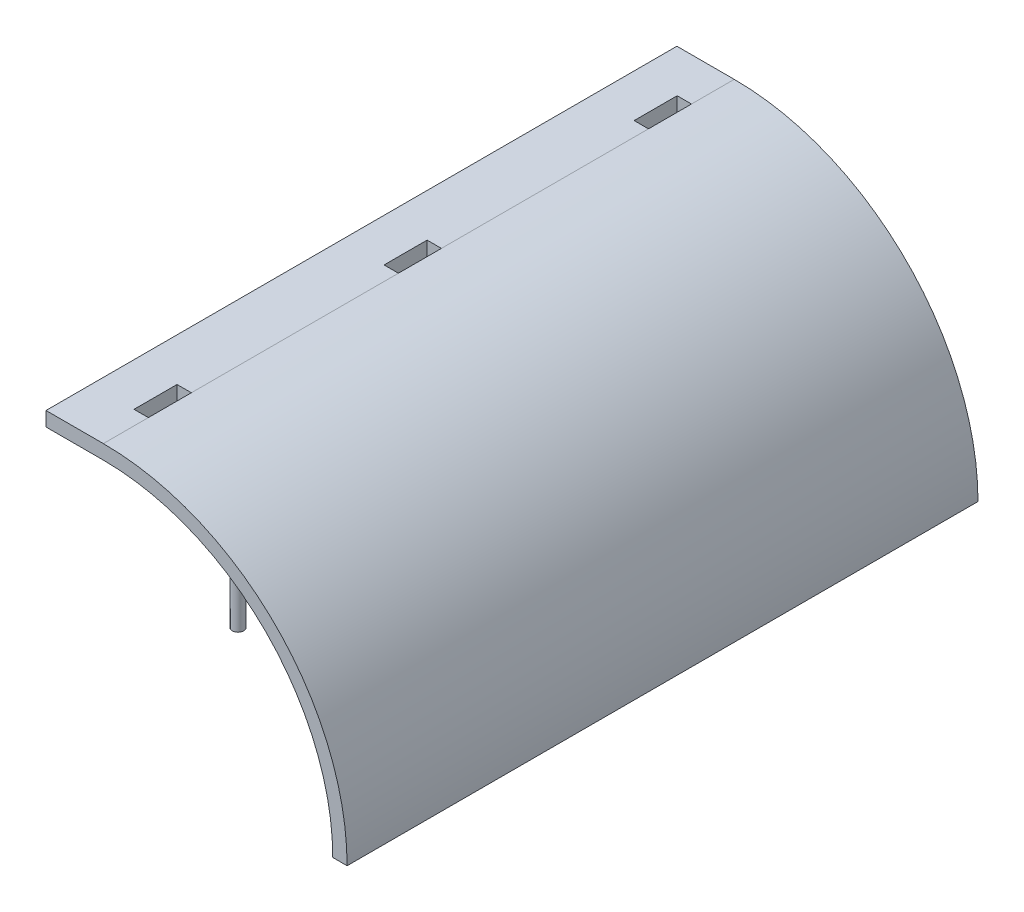
ISO-10303-21;
HEADER;
FILE_DESCRIPTION(('STEP AP214'),'2;1');
FILE_NAME('part.step','',(''),(''),'','','');
FILE_SCHEMA(('AUTOMOTIVE_DESIGN { 1 0 10303 214 1 1 1 1 }'));
ENDSEC;
DATA;
#1=APPLICATION_CONTEXT('core data for automotive mechanical design processes');
#2=APPLICATION_PROTOCOL_DEFINITION('international standard','automotive_design',2000,#1);
#3=PRODUCT_CONTEXT('',#1,'mechanical');
#4=PRODUCT('Part','Part','',(#3));
#5=PRODUCT_RELATED_PRODUCT_CATEGORY('part','',(#4));
#6=PRODUCT_DEFINITION_FORMATION('','',#4);
#7=PRODUCT_DEFINITION_CONTEXT('part definition',#1,'design');
#8=PRODUCT_DEFINITION('design','',#6,#7);
#9=PRODUCT_DEFINITION_SHAPE('','',#8);
#10=(LENGTH_UNIT() NAMED_UNIT(*) SI_UNIT(.MILLI.,.METRE.));
#11=(NAMED_UNIT(*) PLANE_ANGLE_UNIT() SI_UNIT($,.RADIAN.));
#12=(NAMED_UNIT(*) SI_UNIT($,.STERADIAN.) SOLID_ANGLE_UNIT());
#13=UNCERTAINTY_MEASURE_WITH_UNIT(LENGTH_MEASURE(1.E-05),#10,'distance_accuracy_value','');
#14=(GEOMETRIC_REPRESENTATION_CONTEXT(3) GLOBAL_UNCERTAINTY_ASSIGNED_CONTEXT((#13)) GLOBAL_UNIT_ASSIGNED_CONTEXT((#10,
#11,#12)) REPRESENTATION_CONTEXT('',''));
#15=CARTESIAN_POINT('',(0.,0.,0.));
#16=DIRECTION('',(0.,0.,1.));
#17=DIRECTION('',(1.,0.,0.));
#18=AXIS2_PLACEMENT_3D('',#15,#16,#17);
#19=CARTESIAN_POINT('',(-50.8,0.,139.7));
#20=DIRECTION('',(0.,0.,-1.));
#21=DIRECTION('',(-1.,0.,0.));
#22=AXIS2_PLACEMENT_3D('',#19,#20,#21);
#23=CYLINDRICAL_SURFACE('',#22,50.8);
#24=CARTESIAN_POINT('',(-26.0024047803853,44.3364327762636,135.939690924375));
#25=CARTESIAN_POINT('',(-25.9077970956137,44.2835174167001,135.939687602266));
#26=CARTESIAN_POINT('',(-25.8132237824653,44.2302196496535,135.929103778971));
#27=CARTESIAN_POINT('',(-25.627841202715,44.124979621912,135.886927444249));
#28=CARTESIAN_POINT('',(-25.5370403084927,44.0730404621119,135.855290605326));
#29=CARTESIAN_POINT('',(-25.3758578974787,43.9802270280342,135.777456758495));
#30=CARTESIAN_POINT('',(-25.3044262772846,43.9388414590349,135.734042607818));
#31=CARTESIAN_POINT('',(-25.170077675614,43.8606098719779,135.632594741659));
#32=CARTESIAN_POINT('',(-25.1071406114037,43.8237531660127,135.57459647035));
#33=CARTESIAN_POINT('',(-25.0066045887803,43.7646353740319,135.460634199604));
#34=CARTESIAN_POINT('',(-24.9665523107866,43.7409959690369,135.407536636589));
#35=CARTESIAN_POINT('',(-24.894613692683,43.698429101581,135.294340095344));
#36=CARTESIAN_POINT('',(-24.8627237756923,43.6794995752756,135.234244200754));
#37=CARTESIAN_POINT('',(-24.8084695093702,43.6472376436111,135.10805100329));
#38=CARTESIAN_POINT('',(-24.7861578976073,43.6339362319366,135.04192284489));
#39=CARTESIAN_POINT('',(-24.7526157301926,43.6139216713132,134.90595451515));
#40=CARTESIAN_POINT('',(-24.7413791359279,43.6072049321063,134.836116388574));
#41=CARTESIAN_POINT('',(-24.731230458981,43.6011385383595,134.702293026283));
#42=CARTESIAN_POINT('',(-24.7311987270517,43.6011196033493,134.638420531828));
#43=CARTESIAN_POINT('',(-24.740675007983,43.6067840071131,134.511657054306));
#44=CARTESIAN_POINT('',(-24.750180894887,43.6124660751209,134.448765855678));
#45=CARTESIAN_POINT('',(-24.7777799346816,43.6289388727239,134.32774471439));
#46=CARTESIAN_POINT('',(-24.7955928493421,43.6395628586722,134.269527169313));
#47=CARTESIAN_POINT('',(-24.8388848299786,43.665330990089,134.157096895186));
#48=CARTESIAN_POINT('',(-24.8643653349023,43.6804759839937,134.102884920228));
#49=CARTESIAN_POINT('',(-24.9238802260725,43.7157602395213,133.996150705986));
#50=CARTESIAN_POINT('',(-24.9583613935139,43.7361592370148,133.943964743314));
#51=CARTESIAN_POINT('',(-25.0336632781806,43.7805642077832,133.846127915399));
#52=CARTESIAN_POINT('',(-25.0744867127073,43.8045717269606,133.800479867468));
#53=CARTESIAN_POINT('',(-25.1666966275691,43.8586017763956,133.710985436177));
#54=CARTESIAN_POINT('',(-25.2187654195145,43.8890010516375,133.668070449751));
#55=CARTESIAN_POINT('',(-25.3278934394111,43.9524262952542,133.591552630165));
#56=CARTESIAN_POINT('',(-25.3849552555445,43.9854536250929,133.557954664644));
#57=CARTESIAN_POINT('',(-25.5107148905747,44.057893743231,133.496369584083));
#58=CARTESIAN_POINT('',(-25.5799410494685,44.097564922873,133.469762173318));
#59=CARTESIAN_POINT('',(-25.7213049093367,44.1781131652285,133.429005354552));
#60=CARTESIAN_POINT('',(-25.7934440555242,44.2189908237345,133.414862211849));
#61=CARTESIAN_POINT('',(-25.9458728324369,44.3048609877018,133.398423607189));
#62=CARTESIAN_POINT('',(-26.0262872217917,44.3498764812818,133.397377331382));
#63=CARTESIAN_POINT('',(-26.1864330112626,44.438955007958,133.410528040411));
#64=CARTESIAN_POINT('',(-26.266164204758,44.4830177586532,133.424729483288));
#65=CARTESIAN_POINT('',(-26.423569794645,44.5694717117354,133.468741597251));
#66=CARTESIAN_POINT('',(-26.5012064176275,44.6118354052177,133.498743675672));
#67=CARTESIAN_POINT('',(-26.6506172238426,44.6928912755969,133.574372808051));
#68=CARTESIAN_POINT('',(-26.7223934652317,44.7315847422505,133.619994346993));
#69=CARTESIAN_POINT('',(-26.8517534806838,44.8009650391969,133.722183618082));
#70=CARTESIAN_POINT('',(-26.9100042837289,44.8320388171342,133.777639315768));
#71=CARTESIAN_POINT('',(-27.0160435322713,44.8883840706233,133.900284256402));
#72=CARTESIAN_POINT('',(-27.0638428992286,44.9136616044483,133.96746111775));
#73=CARTESIAN_POINT('',(-27.1409650373498,44.9543293634287,134.102386817358));
#74=CARTESIAN_POINT('',(-27.1718633093323,44.9705675366691,134.168979716159));
#75=CARTESIAN_POINT('',(-27.2219091877878,44.9968270292386,134.307583430237));
#76=CARTESIAN_POINT('',(-27.2410671141783,45.0068538085489,134.379589424636));
#77=CARTESIAN_POINT('',(-27.2650869735567,45.0194183584763,134.518269891882));
#78=CARTESIAN_POINT('',(-27.2712992352161,45.022663616628,134.584649488643));
#79=CARTESIAN_POINT('',(-27.2732388127987,45.0236772335878,134.717594584625));
#80=CARTESIAN_POINT('',(-27.268969643565,45.0214474284035,134.78416001405));
#81=CARTESIAN_POINT('',(-27.2506016872767,45.0118421765031,134.912408002217));
#82=CARTESIAN_POINT('',(-27.2369588716948,45.0047054128569,134.974174937634));
#83=CARTESIAN_POINT('',(-27.2009433487907,44.985830384217,135.094357176412));
#84=CARTESIAN_POINT('',(-27.1785700803647,44.9740918234668,135.152772264073));
#85=CARTESIAN_POINT('',(-27.1252428017428,44.9460432107175,135.266510966009));
#86=CARTESIAN_POINT('',(-27.0940591398133,44.9296106573181,135.321696132872));
#87=CARTESIAN_POINT('',(-27.0245987817877,44.8928929508357,135.425963071106));
#88=CARTESIAN_POINT('',(-26.9863203507643,44.8726068553923,135.475043344693));
#89=CARTESIAN_POINT('',(-26.9003657869262,44.8268897726062,135.57026005892));
#90=CARTESIAN_POINT('',(-26.8521647586237,44.8011664779525,135.615781138809));
#91=CARTESIAN_POINT('',(-26.7503883175682,44.7466145598762,135.698142597682));
#92=CARTESIAN_POINT('',(-26.6968090515714,44.7177837089349,135.734976688661));
#93=CARTESIAN_POINT('',(-26.5792609657575,44.6542356447178,135.80339414214));
#94=CARTESIAN_POINT('',(-26.5148082495713,44.6192236910014,135.833870563104));
#95=CARTESIAN_POINT('',(-26.3828412507323,44.547143599678,135.883417264837));
#96=CARTESIAN_POINT('',(-26.3153296380371,44.5100772491731,135.902497294195));
#97=CARTESIAN_POINT('',(-26.2066446047816,44.4500732806297,135.923838678023));
#98=CARTESIAN_POINT('',(-26.1659403868428,44.4275284206938,135.929784897206));
#99=CARTESIAN_POINT('',(-26.0842902886135,44.3821572426362,135.937712549692));
#100=CARTESIAN_POINT('',(-26.0433443163733,44.3593308132719,135.93969236195));
#101=CARTESIAN_POINT('',(-26.0024047803853,44.3364327762636,135.939690924375));
#102=B_SPLINE_CURVE_WITH_KNOTS('',3,(#24,#25,#26,#27,#28,#29,#30,#31,#32,#33,#34,#35,#36,#37,
#38,#39,#40,#41,#42,#43,#44,#45,#46,#47,#48,#49,#50,#51,#52,#53,#54,#55,#56,#57,#58,#59,#60,#61,
#62,#63,#64,#65,#66,#67,#68,#69,#70,#71,#72,#73,#74,#75,#76,#77,#78,#79,#80,#81,#82,#83,#84,#85,
#86,#87,#88,#89,#90,#91,#92,#93,#94,#95,#96,#97,#98,#99,#100,#101),.UNSPECIFIED.,.T.,.F.,(4,2,2,
2,2,2,2,2,2,2,2,2,2,2,2,2,2,2,2,2,2,2,2,2,2,2,2,2,2,2,2,2,2,2,2,2,2,2,4),(0.,0.324975568102103,
0.650637552112255,0.928989831698359,1.20667205438404,1.41756049124227,1.62835635448151,
1.84029840792817,2.05212483670839,2.24277778639392,2.43338824855007,2.61798810837332,
2.80262263298185,2.99920331902193,3.19586846218269,3.41701144821884,3.63826975272966,
3.88954713762719,4.14095075786181,4.41616877009426,4.69146727092844,4.9701801321345,
5.24879468498414,5.50597626874384,5.76288780671123,5.98717445243785,6.2112636634155,
6.4104897211226,6.60964897949185,6.79974872108655,6.98986068234705,7.1854761331085,
7.3811394821759,7.59361601375989,7.80624587587569,8.04357496385247,8.28070074625623,
8.42126982290034,8.56189633751887),.UNSPECIFIED.);
#103=CARTESIAN_POINT('',(-26.0024047803853,44.3364327762636,135.939690924375));
#104=VERTEX_POINT('',#103);
#105=EDGE_CURVE('E385',#104,#104,#102,.T.);
#106=ORIENTED_EDGE('',*,*,#105,.T.);
#107=EDGE_LOOP('',(#106));
#108=FACE_BOUND('',#107,.T.);
#109=CARTESIAN_POINT('',(-25.4,43.9940905122495,6.0325));
#110=CARTESIAN_POINT('',(-25.3061930589518,43.9399302677921,6.03249706502773));
#111=CARTESIAN_POINT('',(-25.2124348325613,43.8853941623707,6.02209428069817));
#112=CARTESIAN_POINT('',(-25.0285469097943,43.7776610190611,5.98062617448766));
#113=CARTESIAN_POINT('',(-24.9384251607567,43.7244670001808,5.94951794847166));
#114=CARTESIAN_POINT('',(-24.7770440173108,43.6285846309277,5.87233873862166));
#115=CARTESIAN_POINT('',(-24.7048623677804,43.5854344398171,5.82877202830873));
#116=CARTESIAN_POINT('',(-24.5690512551844,43.5038340412088,5.72666154503968));
#117=CARTESIAN_POINT('',(-24.5054012820107,43.4653725829497,5.66815470983431));
#118=CARTESIAN_POINT('',(-24.4044443758354,43.4041152187238,5.55372436014403));
#119=CARTESIAN_POINT('',(-24.3645440490891,43.3798160100368,5.50087938562957));
#120=CARTESIAN_POINT('',(-24.2927950963588,43.3360110438586,5.38816037571907));
#121=CARTESIAN_POINT('',(-24.2609427103654,43.3165030480254,5.3282896419859));
#122=CARTESIAN_POINT('',(-24.2066637281793,43.2832010772079,5.20246401016061));
#123=CARTESIAN_POINT('',(-24.1842926272585,43.2694407507149,5.13647597327491));
#124=CARTESIAN_POINT('',(-24.150586550332,43.2486897414803,5.00071626990155));
#125=CARTESIAN_POINT('',(-24.1392450450109,43.2416950536197,4.93094686777131));
#126=CARTESIAN_POINT('',(-24.1289089373564,43.2353204002695,4.7975452066651));
#127=CARTESIAN_POINT('',(-24.128745991177,43.2352198807638,4.734035164536));
#128=CARTESIAN_POINT('',(-24.1378545644204,43.2408375208847,4.60796959962318));
#129=CARTESIAN_POINT('',(-24.1471239267416,43.2465543501251,4.54541386191683));
#130=CARTESIAN_POINT('',(-24.1741189622738,43.2631794456951,4.42517883177899));
#131=CARTESIAN_POINT('',(-24.1915460772966,43.2739043929369,4.36740603223128));
#132=CARTESIAN_POINT('',(-24.2339273370687,43.2999353185946,4.25580491535197));
#133=CARTESIAN_POINT('',(-24.2588829145948,43.3152421690095,4.20197735128238));
#134=CARTESIAN_POINT('',(-24.3172510736059,43.3509544562581,4.09581623978669));
#135=CARTESIAN_POINT('',(-24.3511197031474,43.3716336527468,4.04382690790398));
#136=CARTESIAN_POINT('',(-24.4250909524587,43.4166563367409,3.94628655109842));
#137=CARTESIAN_POINT('',(-24.4651963218677,43.4410014403123,3.9007383829339));
#138=CARTESIAN_POINT('',(-24.5560358745254,43.4959482215811,3.81107498914446));
#139=CARTESIAN_POINT('',(-24.6074740871129,43.5269517937532,3.7679203624075));
#140=CARTESIAN_POINT('',(-24.7153041422483,43.5916574923818,3.69082315630759));
#141=CARTESIAN_POINT('',(-24.7716986353169,43.6253610618806,3.65688554619031));
#142=CARTESIAN_POINT('',(-24.8964607749137,43.6995725115739,3.59421399185978));
#143=CARTESIAN_POINT('',(-24.9653861998202,43.7403634050559,3.56692235219349));
#144=CARTESIAN_POINT('',(-25.1062058239432,43.8232316070647,3.52476266082332));
#145=CARTESIAN_POINT('',(-25.1781015641934,43.865309580328,3.50990114514996));
#146=CARTESIAN_POINT('',(-25.3306272378628,43.95406229997,3.49184383907831));
#147=CARTESIAN_POINT('',(-25.4114009750961,44.0007687560273,3.48999029019731));
#148=CARTESIAN_POINT('',(-25.5723968863636,44.093272365234,3.50166836930486));
#149=CARTESIAN_POINT('',(-25.652618870777,44.1390692150788,3.5152050442968));
#150=CARTESIAN_POINT('',(-25.8114260414631,44.2291717391538,3.55813307344838));
#151=CARTESIAN_POINT('',(-25.8899648925647,44.2734421052665,3.58777320218689));
#152=CARTESIAN_POINT('',(-26.0412577756716,44.3582258152379,3.66303786962348));
#153=CARTESIAN_POINT('',(-26.1140138199066,44.3987404667872,3.70865681806876));
#154=CARTESIAN_POINT('',(-26.2450776236778,44.4713498907015,3.81112977720533));
#155=CARTESIAN_POINT('',(-26.304073779571,44.5038577021558,3.86680487275386));
#156=CARTESIAN_POINT('',(-26.4115266102851,44.5628334610154,3.99023973451133));
#157=CARTESIAN_POINT('',(-26.4599952695651,44.589308278063,4.05798559770741));
#158=CARTESIAN_POINT('',(-26.5378579837551,44.6317170926981,4.1937642366759));
#159=CARTESIAN_POINT('',(-26.5689396552314,44.6485892671558,4.26053627208033));
#160=CARTESIAN_POINT('',(-26.6192909012665,44.6758787099015,4.39961990493336));
#161=CARTESIAN_POINT('',(-26.6385717691387,44.686302149702,4.47192613137941));
#162=CARTESIAN_POINT('',(-26.662621984109,44.699296907328,4.61068683536792));
#163=CARTESIAN_POINT('',(-26.6688391471709,44.7026517633324,4.67682059663292));
#164=CARTESIAN_POINT('',(-26.6708630371238,44.7037442873356,4.80928443151395));
#165=CARTESIAN_POINT('',(-26.6666734625018,44.7014839509374,4.87561442702123));
#166=CARTESIAN_POINT('',(-26.6485655908808,44.6917029324596,5.00319682775957));
#167=CARTESIAN_POINT('',(-26.6351307025917,44.684443618946,5.06453924055783));
#168=CARTESIAN_POINT('',(-26.5996649177836,44.6652458339339,5.18390411392578));
#169=CARTESIAN_POINT('',(-26.5776334546454,44.6533070540011,5.24192635536655));
#170=CARTESIAN_POINT('',(-26.5250971373246,44.6247689807743,5.35500431645702));
#171=CARTESIAN_POINT('',(-26.4943550467462,44.6080390379601,5.40991622663398));
#172=CARTESIAN_POINT('',(-26.4258930920139,44.5706678304992,5.51370732245852));
#173=CARTESIAN_POINT('',(-26.3881714171282,44.5500255508308,5.56258493711436));
#174=CARTESIAN_POINT('',(-26.3033018778288,44.5034192562236,5.65769058261636));
#175=CARTESIAN_POINT('',(-26.2556099263193,44.4771427098743,5.70327865268766));
#176=CARTESIAN_POINT('',(-26.1549126812713,44.4214248481286,5.78585396454721));
#177=CARTESIAN_POINT('',(-26.1019035861829,44.3919812673227,5.82283498900409));
#178=CARTESIAN_POINT('',(-25.9852631595158,44.3268972244136,5.89188252731813));
#179=CARTESIAN_POINT('',(-25.9211258553232,44.2909393891135,5.9227933480337));
#180=CARTESIAN_POINT('',(-25.7897764942852,44.2169017078103,5.97325218329478));
#181=CARTESIAN_POINT('',(-25.7225668072102,44.1788234925,5.99280880113823));
#182=CARTESIAN_POINT('',(-25.6125474718966,44.1161488406576,6.015324187156));
#183=CARTESIAN_POINT('',(-25.5701953982833,44.0919420228722,6.02176773628304));
#184=CARTESIAN_POINT('',(-25.485225596973,44.0432128997708,6.03035713523749));
#185=CARTESIAN_POINT('',(-25.4426077734712,44.0186904768278,6.03250133308508));
#186=CARTESIAN_POINT('',(-25.4,43.9940905122495,6.0325));
#187=B_SPLINE_CURVE_WITH_KNOTS('',3,(#109,#110,#111,#112,#113,#114,#115,#116,#117,#118,#119,
#120,#121,#122,#123,#124,#125,#126,#127,#128,#129,#130,#131,#132,#133,#134,#135,#136,#137,#138,
#139,#140,#141,#142,#143,#144,#145,#146,#147,#148,#149,#150,#151,#152,#153,#154,#155,#156,#157,
#158,#159,#160,#161,#162,#163,#164,#165,#166,#167,#168,#169,#170,#171,#172,#173,#174,#175,#176,
#177,#178,#179,#180,#181,#182,#183,#184,#185,#186),.UNSPECIFIED.,.T.,.F.,(4,2,2,2,2,2,2,2,2,2,2,
2,2,2,2,2,2,2,2,2,2,2,2,2,2,2,2,2,2,2,2,2,2,2,2,2,2,2,4),(0.,0.324728915395914,
0.650132811221326,0.93276381640066,1.21470270237038,1.42544520183109,1.63608905927153,
1.84794936431751,2.05968417552262,2.24925141989505,2.43877532133125,2.62184856422205,
2.80495667063769,3.00038517773621,3.19590009044978,3.41689890751841,3.63801663802308,
3.89081630539183,4.1437488169244,4.42244117264117,4.70122494789056,4.98444332613472,
5.26756271812295,5.52821387733015,5.78856673879627,6.01394983867609,6.23911690935676,
6.43762551403803,6.63606358014415,6.82484390719071,7.01363667926762,7.20816890788817,
7.40275167545443,7.61494170472564,7.82728453780307,8.06561990033158,8.30377443508307,
8.45121195564729,8.59870611665631),.UNSPECIFIED.);
#188=CARTESIAN_POINT('',(-25.4,43.9940905122495,6.0325));
#189=VERTEX_POINT('',#188);
#190=EDGE_CURVE('E190',#189,#189,#187,.T.);
#191=ORIENTED_EDGE('',*,*,#190,.T.);
#192=EDGE_LOOP('',(#191));
#193=FACE_BOUND('',#192,.T.);
#194=CARTESIAN_POINT('',(-50.8,0.,0.));
#195=DIRECTION('',(0.,0.,-1.));
#196=DIRECTION('',(1.,0.,0.));
#197=AXIS2_PLACEMENT_3D('',#194,#195,#196);
#198=CIRCLE('',#197,50.8);
#199=CARTESIAN_POINT('',(-50.8,50.8,0.));
#200=VERTEX_POINT('',#199);
#201=CARTESIAN_POINT('',(0.,0.,0.));
#202=VERTEX_POINT('',#201);
#203=EDGE_CURVE('E283',#200,#202,#198,.T.);
#204=ORIENTED_EDGE('',*,*,#203,.T.);
#205=DIRECTION('',(0.,0.,-1.));
#206=VECTOR('',#205,1.);
#207=CARTESIAN_POINT('',(0.,0.,139.7));
#208=LINE('',#207,#206);
#209=CARTESIAN_POINT('',(0.,0.,139.7));
#210=VERTEX_POINT('',#209);
#211=EDGE_CURVE('E11',#210,#202,#208,.T.);
#212=ORIENTED_EDGE('',*,*,#211,.F.);
#213=CARTESIAN_POINT('',(-50.8,0.,139.7));
#214=DIRECTION('',(0.,0.,-1.));
#215=DIRECTION('',(1.,0.,0.));
#216=AXIS2_PLACEMENT_3D('',#213,#214,#215);
#217=CIRCLE('',#216,50.8);
#218=CARTESIAN_POINT('',(-50.8,50.8,139.7));
#219=VERTEX_POINT('',#218);
#220=EDGE_CURVE('E284',#219,#210,#217,.T.);
#221=ORIENTED_EDGE('',*,*,#220,.F.);
#222=DIRECTION('',(0.,0.,-1.));
#223=VECTOR('',#222,1.);
#224=CARTESIAN_POINT('',(-50.8,50.8,139.7));
#225=LINE('',#224,#223);
#226=CARTESIAN_POINT('',(-50.8,50.8,129.734207481242));
#227=VERTEX_POINT('',#226);
#228=EDGE_CURVE('E308',#219,#227,#225,.T.);
#229=ORIENTED_EDGE('',*,*,#228,.T.);
#230=DIRECTION('',(0.,0.,1.));
#231=VECTOR('',#230,1.);
#232=CARTESIAN_POINT('',(-50.8,50.8,129.734207481242));
#233=LINE('',#232,#231);
#234=CARTESIAN_POINT('',(-50.8,50.8,120.209207481242));
#235=VERTEX_POINT('',#234);
#236=EDGE_CURVE('E258',#235,#227,#233,.T.);
#237=ORIENTED_EDGE('',*,*,#236,.F.);
#238=CARTESIAN_POINT('',(-50.8,50.8,74.3622074812416));
#239=VERTEX_POINT('',#238);
#240=EDGE_CURVE('E312',#235,#239,#225,.T.);
#241=ORIENTED_EDGE('',*,*,#240,.T.);
#242=DIRECTION('',(0.,0.,1.));
#243=VECTOR('',#242,1.);
#244=CARTESIAN_POINT('',(-50.8,50.8,74.3622074812416));
#245=LINE('',#244,#243);
#246=CARTESIAN_POINT('',(-50.8,50.8,64.8372074812415));
#247=VERTEX_POINT('',#246);
#248=EDGE_CURVE('E187',#247,#239,#245,.T.);
#249=ORIENTED_EDGE('',*,*,#248,.F.);
#250=CARTESIAN_POINT('',(-50.8,50.8,18.9902074812416));
#251=VERTEX_POINT('',#250);
#252=EDGE_CURVE('E361',#247,#251,#225,.T.);
#253=ORIENTED_EDGE('',*,*,#252,.T.);
#254=DIRECTION('',(0.,0.,1.));
#255=VECTOR('',#254,1.);
#256=CARTESIAN_POINT('',(-50.8,50.8,18.9902074812416));
#257=LINE('',#256,#255);
#258=CARTESIAN_POINT('',(-50.8,50.8,9.46520748124155));
#259=VERTEX_POINT('',#258);
#260=EDGE_CURVE('E228',#259,#251,#257,.T.);
#261=ORIENTED_EDGE('',*,*,#260,.F.);
#262=EDGE_CURVE('E296',#259,#200,#225,.T.);
#263=ORIENTED_EDGE('',*,*,#262,.T.);
#264=EDGE_LOOP('',(#204,#212,#221,#229,#237,#241,#249,#253,#261,#263));
#265=FACE_BOUND('',#264,.T.);
#266=ADVANCED_FACE('F35',(#108,#193,#265),#23,.F.);
#267=CARTESIAN_POINT('',(3.175,0.,139.7));
#268=DIRECTION('',(0.,1.,0.));
#269=DIRECTION('',(-1.,0.,0.));
#270=AXIS2_PLACEMENT_3D('',#267,#268,#269);
#271=PLANE('',#270);
#272=DIRECTION('',(1.,0.,0.));
#273=VECTOR('',#272,1.);
#274=CARTESIAN_POINT('',(3.175,0.,0.));
#275=LINE('',#274,#273);
#276=CARTESIAN_POINT('',(3.175,0.,0.));
#277=VERTEX_POINT('',#276);
#278=EDGE_CURVE('E299',#202,#277,#275,.T.);
#279=ORIENTED_EDGE('',*,*,#278,.T.);
#280=DIRECTION('',(0.,0.,-1.));
#281=VECTOR('',#280,1.);
#282=CARTESIAN_POINT('',(3.175,0.,139.7));
#283=LINE('',#282,#281);
#284=CARTESIAN_POINT('',(3.175,0.,139.7));
#285=VERTEX_POINT('',#284);
#286=EDGE_CURVE('E43',#285,#277,#283,.T.);
#287=ORIENTED_EDGE('',*,*,#286,.F.);
#288=DIRECTION('',(1.,0.,0.));
#289=VECTOR('',#288,1.);
#290=CARTESIAN_POINT('',(3.175,0.,139.7));
#291=LINE('',#290,#289);
#292=EDGE_CURVE('E287',#210,#285,#291,.T.);
#293=ORIENTED_EDGE('',*,*,#292,.F.);
#294=ORIENTED_EDGE('',*,*,#211,.T.);
#295=EDGE_LOOP('',(#279,#287,#293,#294));
#296=FACE_BOUND('',#295,.T.);
#297=ADVANCED_FACE('F375',(#296),#271,.F.);
#298=CARTESIAN_POINT('',(-50.8,0.,139.7));
#299=DIRECTION('',(0.,0.,-1.));
#300=DIRECTION('',(-1.,0.,0.));
#301=AXIS2_PLACEMENT_3D('',#298,#299,#300);
#302=CYLINDRICAL_SURFACE('',#301,53.975);
#303=CARTESIAN_POINT('',(-50.8,0.,0.));
#304=DIRECTION('',(0.,0.,1.));
#305=DIRECTION('',(1.,0.,0.));
#306=AXIS2_PLACEMENT_3D('',#303,#304,#305);
#307=CIRCLE('',#306,53.975);
#308=CARTESIAN_POINT('',(-50.8,53.975,0.));
#309=VERTEX_POINT('',#308);
#310=EDGE_CURVE('E301',#277,#309,#307,.T.);
#311=ORIENTED_EDGE('',*,*,#310,.T.);
#312=DIRECTION('',(0.,0.,-1.));
#313=VECTOR('',#312,1.);
#314=CARTESIAN_POINT('',(-50.8,53.975,139.7));
#315=LINE('',#314,#313);
#316=CARTESIAN_POINT('',(-50.8,53.975,9.46520748124155));
#317=VERTEX_POINT('',#316);
#318=EDGE_CURVE('E311',#317,#309,#315,.T.);
#319=ORIENTED_EDGE('',*,*,#318,.F.);
#320=DIRECTION('',(0.,0.,1.));
#321=VECTOR('',#320,1.);
#322=CARTESIAN_POINT('',(-50.8,53.975,18.9902074812416));
#323=LINE('',#322,#321);
#324=CARTESIAN_POINT('',(-50.8,53.975,18.9902074812416));
#325=VERTEX_POINT('',#324);
#326=EDGE_CURVE('E50',#317,#325,#323,.T.);
#327=ORIENTED_EDGE('',*,*,#326,.T.);
#328=CARTESIAN_POINT('',(-50.8,53.975,64.8372074812415));
#329=VERTEX_POINT('',#328);
#330=EDGE_CURVE('E452',#329,#325,#315,.T.);
#331=ORIENTED_EDGE('',*,*,#330,.F.);
#332=DIRECTION('',(0.,0.,1.));
#333=VECTOR('',#332,1.);
#334=CARTESIAN_POINT('',(-50.8,53.975,74.3622074812416));
#335=LINE('',#334,#333);
#336=CARTESIAN_POINT('',(-50.8,53.975,74.3622074812416));
#337=VERTEX_POINT('',#336);
#338=EDGE_CURVE('E58',#329,#337,#335,.T.);
#339=ORIENTED_EDGE('',*,*,#338,.T.);
#340=CARTESIAN_POINT('',(-50.8,53.975,120.209207481242));
#341=VERTEX_POINT('',#340);
#342=EDGE_CURVE('E315',#341,#337,#315,.T.);
#343=ORIENTED_EDGE('',*,*,#342,.F.);
#344=DIRECTION('',(0.,0.,1.));
#345=VECTOR('',#344,1.);
#346=CARTESIAN_POINT('',(-50.8,53.975,129.734207481242));
#347=LINE('',#346,#345);
#348=CARTESIAN_POINT('',(-50.8,53.975,129.734207481242));
#349=VERTEX_POINT('',#348);
#350=EDGE_CURVE('E247',#341,#349,#347,.T.);
#351=ORIENTED_EDGE('',*,*,#350,.T.);
#352=CARTESIAN_POINT('',(-50.8,53.975,139.7));
#353=VERTEX_POINT('',#352);
#354=EDGE_CURVE('E313',#353,#349,#315,.T.);
#355=ORIENTED_EDGE('',*,*,#354,.F.);
#356=CARTESIAN_POINT('',(-50.8,0.,139.7));
#357=DIRECTION('',(0.,0.,1.));
#358=DIRECTION('',(1.,0.,0.));
#359=AXIS2_PLACEMENT_3D('',#356,#357,#358);
#360=CIRCLE('',#359,53.975);
#361=EDGE_CURVE('E290',#285,#353,#360,.T.);
#362=ORIENTED_EDGE('',*,*,#361,.F.);
#363=ORIENTED_EDGE('',*,*,#286,.T.);
#364=EDGE_LOOP('',(#311,#319,#327,#331,#339,#343,#351,#355,#362,#363));
#365=FACE_BOUND('',#364,.T.);
#366=ADVANCED_FACE('F321',(#365),#302,.T.);
#367=CARTESIAN_POINT('',(-50.8,53.975,139.7));
#368=DIRECTION('',(0.,-1.,0.));
#369=DIRECTION('',(0.,0.,-1.));
#370=AXIS2_PLACEMENT_3D('',#367,#368,#369);
#371=PLANE('',#370);
#372=ORIENTED_EDGE('',*,*,#342,.T.);
#373=DIRECTION('',(-1.,0.,0.));
#374=VECTOR('',#373,1.);
#375=CARTESIAN_POINT('',(-53.9749999999997,53.975,74.3622074812416));
#376=LINE('',#375,#374);
#377=CARTESIAN_POINT('',(-53.9749999999997,53.975,74.3622074812416));
#378=VERTEX_POINT('',#377);
#379=EDGE_CURVE('E172',#337,#378,#376,.T.);
#380=ORIENTED_EDGE('',*,*,#379,.T.);
#381=DIRECTION('',(0.,0.,-1.));
#382=VECTOR('',#381,1.);
#383=CARTESIAN_POINT('',(-53.9749999999997,53.975,74.3622074812416));
#384=LINE('',#383,#382);
#385=CARTESIAN_POINT('',(-53.9749999999997,53.975,64.8372074812415));
#386=VERTEX_POINT('',#385);
#387=EDGE_CURVE('E164',#378,#386,#384,.T.);
#388=ORIENTED_EDGE('',*,*,#387,.T.);
#389=DIRECTION('',(1.,0.,0.));
#390=VECTOR('',#389,1.);
#391=CARTESIAN_POINT('',(-53.9749999999997,53.975,64.8372074812415));
#392=LINE('',#391,#390);
#393=EDGE_CURVE('E175',#386,#329,#392,.T.);
#394=ORIENTED_EDGE('',*,*,#393,.T.);
#395=ORIENTED_EDGE('',*,*,#330,.T.);
#396=DIRECTION('',(-1.,0.,0.));
#397=VECTOR('',#396,1.);
#398=CARTESIAN_POINT('',(-53.9749999999997,53.975,18.9902074812416));
#399=LINE('',#398,#397);
#400=CARTESIAN_POINT('',(-53.9749999999997,53.975,18.9902074812416));
#401=VERTEX_POINT('',#400);
#402=EDGE_CURVE('E219',#325,#401,#399,.T.);
#403=ORIENTED_EDGE('',*,*,#402,.T.);
#404=DIRECTION('',(0.,0.,-1.));
#405=VECTOR('',#404,1.);
#406=CARTESIAN_POINT('',(-53.9749999999997,53.975,18.9902074812416));
#407=LINE('',#406,#405);
#408=CARTESIAN_POINT('',(-53.9749999999997,53.975,9.46520748124155));
#409=VERTEX_POINT('',#408);
#410=EDGE_CURVE('E211',#401,#409,#407,.T.);
#411=ORIENTED_EDGE('',*,*,#410,.T.);
#412=DIRECTION('',(1.,0.,0.));
#413=VECTOR('',#412,1.);
#414=CARTESIAN_POINT('',(-53.9749999999997,53.975,9.46520748124155));
#415=LINE('',#414,#413);
#416=EDGE_CURVE('E214',#409,#317,#415,.T.);
#417=ORIENTED_EDGE('',*,*,#416,.T.);
#418=ORIENTED_EDGE('',*,*,#318,.T.);
#419=DIRECTION('',(-1.,0.,0.));
#420=VECTOR('',#419,1.);
#421=CARTESIAN_POINT('',(-50.8,53.975,0.));
#422=LINE('',#421,#420);
#423=CARTESIAN_POINT('',(-63.5,53.975,0.));
#424=VERTEX_POINT('',#423);
#425=EDGE_CURVE('E304',#309,#424,#422,.T.);
#426=ORIENTED_EDGE('',*,*,#425,.T.);
#427=DIRECTION('',(0.,0.,-1.));
#428=VECTOR('',#427,1.);
#429=CARTESIAN_POINT('',(-63.5,53.975,0.));
#430=LINE('',#429,#428);
#431=CARTESIAN_POINT('',(-63.5,53.975,139.7));
#432=VERTEX_POINT('',#431);
#433=EDGE_CURVE('E280',#432,#424,#430,.T.);
#434=ORIENTED_EDGE('',*,*,#433,.F.);
#435=DIRECTION('',(-1.,0.,0.));
#436=VECTOR('',#435,1.);
#437=CARTESIAN_POINT('',(-50.8,53.975,139.7));
#438=LINE('',#437,#436);
#439=EDGE_CURVE('E292',#353,#432,#438,.T.);
#440=ORIENTED_EDGE('',*,*,#439,.F.);
#441=ORIENTED_EDGE('',*,*,#354,.T.);
#442=DIRECTION('',(-1.,0.,0.));
#443=VECTOR('',#442,1.);
#444=CARTESIAN_POINT('',(-53.9749999999997,53.975,129.734207481242));
#445=LINE('',#444,#443);
#446=CARTESIAN_POINT('',(-53.9749999999997,53.975,129.734207481242));
#447=VERTEX_POINT('',#446);
#448=EDGE_CURVE('E250',#349,#447,#445,.T.);
#449=ORIENTED_EDGE('',*,*,#448,.T.);
#450=DIRECTION('',(0.,0.,-1.));
#451=VECTOR('',#450,1.);
#452=CARTESIAN_POINT('',(-53.9749999999997,53.975,129.734207481242));
#453=LINE('',#452,#451);
#454=CARTESIAN_POINT('',(-53.9749999999997,53.975,120.209207481242));
#455=VERTEX_POINT('',#454);
#456=EDGE_CURVE('E240',#447,#455,#453,.T.);
#457=ORIENTED_EDGE('',*,*,#456,.T.);
#458=DIRECTION('',(1.,0.,0.));
#459=VECTOR('',#458,1.);
#460=CARTESIAN_POINT('',(-53.9749999999997,53.975,120.209207481242));
#461=LINE('',#460,#459);
#462=EDGE_CURVE('E243',#455,#341,#461,.T.);
#463=ORIENTED_EDGE('',*,*,#462,.T.);
#464=EDGE_LOOP('',(#372,#380,#388,#394,#395,#403,#411,#417,#418,#426,#434,#440,#441,#449,#457,#463));
#465=FACE_BOUND('',#464,.T.);
#466=ADVANCED_FACE('F182',(#465),#371,.F.);
#467=CARTESIAN_POINT('',(-50.8,50.8,139.7));
#468=DIRECTION('',(0.,1.,0.));
#469=DIRECTION('',(0.,0.,1.));
#470=AXIS2_PLACEMENT_3D('',#467,#468,#469);
#471=PLANE('',#470);
#472=DIRECTION('',(0.,0.,-1.));
#473=VECTOR('',#472,1.);
#474=CARTESIAN_POINT('',(-53.9749999999997,50.8,74.3622074812416));
#475=LINE('',#474,#473);
#476=CARTESIAN_POINT('',(-53.9749999999997,50.8,74.3622074812416));
#477=VERTEX_POINT('',#476);
#478=CARTESIAN_POINT('',(-53.9749999999997,50.8,64.8372074812415));
#479=VERTEX_POINT('',#478);
#480=EDGE_CURVE('E167',#477,#479,#475,.T.);
#481=ORIENTED_EDGE('',*,*,#480,.F.);
#482=DIRECTION('',(-1.,0.,0.));
#483=VECTOR('',#482,1.);
#484=CARTESIAN_POINT('',(-53.9749999999997,50.8,74.3622074812416));
#485=LINE('',#484,#483);
#486=EDGE_CURVE('E184',#239,#477,#485,.T.);
#487=ORIENTED_EDGE('',*,*,#486,.F.);
#488=ORIENTED_EDGE('',*,*,#240,.F.);
#489=DIRECTION('',(1.,0.,0.));
#490=VECTOR('',#489,1.);
#491=CARTESIAN_POINT('',(-53.9749999999997,50.8,120.209207481242));
#492=LINE('',#491,#490);
#493=CARTESIAN_POINT('',(-53.9749999999997,50.8,120.209207481242));
#494=VERTEX_POINT('',#493);
#495=EDGE_CURVE('E255',#494,#235,#492,.T.);
#496=ORIENTED_EDGE('',*,*,#495,.F.);
#497=DIRECTION('',(0.,0.,-1.));
#498=VECTOR('',#497,1.);
#499=CARTESIAN_POINT('',(-53.9749999999997,50.8,129.734207481242));
#500=LINE('',#499,#498);
#501=CARTESIAN_POINT('',(-53.9749999999997,50.8,129.734207481242));
#502=VERTEX_POINT('',#501);
#503=EDGE_CURVE('E207',#502,#494,#500,.T.);
#504=ORIENTED_EDGE('',*,*,#503,.F.);
#505=DIRECTION('',(-1.,0.,0.));
#506=VECTOR('',#505,1.);
#507=CARTESIAN_POINT('',(-53.9749999999997,50.8,129.734207481242));
#508=LINE('',#507,#506);
#509=EDGE_CURVE('E244',#227,#502,#508,.T.);
#510=ORIENTED_EDGE('',*,*,#509,.F.);
#511=ORIENTED_EDGE('',*,*,#228,.F.);
#512=DIRECTION('',(1.,0.,0.));
#513=VECTOR('',#512,1.);
#514=CARTESIAN_POINT('',(-50.8,50.8,139.7));
#515=LINE('',#514,#513);
#516=CARTESIAN_POINT('',(-63.5,50.8,139.7));
#517=VERTEX_POINT('',#516);
#518=EDGE_CURVE('E294',#517,#219,#515,.T.);
#519=ORIENTED_EDGE('',*,*,#518,.F.);
#520=DIRECTION('',(0.,0.,1.));
#521=VECTOR('',#520,1.);
#522=CARTESIAN_POINT('',(-63.5,50.8,0.));
#523=LINE('',#522,#521);
#524=CARTESIAN_POINT('',(-63.5,50.8,0.));
#525=VERTEX_POINT('',#524);
#526=EDGE_CURVE('E274',#525,#517,#523,.T.);
#527=ORIENTED_EDGE('',*,*,#526,.F.);
#528=DIRECTION('',(1.,0.,0.));
#529=VECTOR('',#528,1.);
#530=CARTESIAN_POINT('',(-50.8,50.8,0.));
#531=LINE('',#530,#529);
#532=EDGE_CURVE('E288',#525,#200,#531,.T.);
#533=ORIENTED_EDGE('',*,*,#532,.T.);
#534=ORIENTED_EDGE('',*,*,#262,.F.);
#535=DIRECTION('',(1.,0.,0.));
#536=VECTOR('',#535,1.);
#537=CARTESIAN_POINT('',(-53.9749999999997,50.8,9.46520748124155));
#538=LINE('',#537,#536);
#539=CARTESIAN_POINT('',(-53.9749999999997,50.8,9.46520748124155));
#540=VERTEX_POINT('',#539);
#541=EDGE_CURVE('E225',#540,#259,#538,.T.);
#542=ORIENTED_EDGE('',*,*,#541,.F.);
#543=DIRECTION('',(0.,0.,-1.));
#544=VECTOR('',#543,1.);
#545=CARTESIAN_POINT('',(-53.9749999999997,50.8,18.9902074812416));
#546=LINE('',#545,#544);
#547=CARTESIAN_POINT('',(-53.9749999999997,50.8,18.9902074812416));
#548=VERTEX_POINT('',#547);
#549=EDGE_CURVE('E223',#548,#540,#546,.T.);
#550=ORIENTED_EDGE('',*,*,#549,.F.);
#551=DIRECTION('',(-1.,0.,0.));
#552=VECTOR('',#551,1.);
#553=CARTESIAN_POINT('',(-53.9749999999997,50.8,18.9902074812416));
#554=LINE('',#553,#552);
#555=EDGE_CURVE('E215',#251,#548,#554,.T.);
#556=ORIENTED_EDGE('',*,*,#555,.F.);
#557=ORIENTED_EDGE('',*,*,#252,.F.);
#558=DIRECTION('',(1.,0.,0.));
#559=VECTOR('',#558,1.);
#560=CARTESIAN_POINT('',(-53.9749999999997,50.8,64.8372074812415));
#561=LINE('',#560,#559);
#562=EDGE_CURVE('E200',#479,#247,#561,.T.);
#563=ORIENTED_EDGE('',*,*,#562,.F.);
#564=EDGE_LOOP('',(#481,#487,#488,#496,#504,#510,#511,#519,#527,#533,#534,#542,#550,#556,#557,#563));
#565=FACE_BOUND('',#564,.T.);
#566=ADVANCED_FACE('F354',(#565),#471,.F.);
#567=CARTESIAN_POINT('',(-50.8,0.,139.7));
#568=DIRECTION('',(0.,0.,1.));
#569=DIRECTION('',(1.,0.,0.));
#570=AXIS2_PLACEMENT_3D('',#567,#568,#569);
#571=PLANE('',#570);
#572=ORIENTED_EDGE('',*,*,#220,.T.);
#573=ORIENTED_EDGE('',*,*,#292,.T.);
#574=ORIENTED_EDGE('',*,*,#361,.T.);
#575=ORIENTED_EDGE('',*,*,#439,.T.);
#576=DIRECTION('',(0.,1.,0.));
#577=VECTOR('',#576,1.);
#578=CARTESIAN_POINT('',(-63.5,53.975,139.7));
#579=LINE('',#578,#577);
#580=EDGE_CURVE('E277',#517,#432,#579,.T.);
#581=ORIENTED_EDGE('',*,*,#580,.F.);
#582=ORIENTED_EDGE('',*,*,#518,.T.);
#583=EDGE_LOOP('',(#572,#573,#574,#575,#581,#582));
#584=FACE_BOUND('',#583,.T.);
#585=ADVANCED_FACE('F337',(#584),#571,.T.);
#586=CARTESIAN_POINT('',(-50.8,0.,0.));
#587=DIRECTION('',(0.,0.,1.));
#588=DIRECTION('',(1.,0.,0.));
#589=AXIS2_PLACEMENT_3D('',#586,#587,#588);
#590=PLANE('',#589);
#591=ORIENTED_EDGE('',*,*,#203,.F.);
#592=ORIENTED_EDGE('',*,*,#532,.F.);
#593=DIRECTION('',(0.,-1.,0.));
#594=VECTOR('',#593,1.);
#595=CARTESIAN_POINT('',(-63.5,53.975,0.));
#596=LINE('',#595,#594);
#597=EDGE_CURVE('E265',#424,#525,#596,.T.);
#598=ORIENTED_EDGE('',*,*,#597,.F.);
#599=ORIENTED_EDGE('',*,*,#425,.F.);
#600=ORIENTED_EDGE('',*,*,#310,.F.);
#601=ORIENTED_EDGE('',*,*,#278,.F.);
#602=EDGE_LOOP('',(#591,#592,#598,#599,#600,#601));
#603=FACE_BOUND('',#602,.T.);
#604=ADVANCED_FACE('F328',(#603),#590,.F.);
#605=CARTESIAN_POINT('',(-63.5,0.,0.));
#606=DIRECTION('',(-1.,0.,0.));
#607=DIRECTION('',(0.,0.,1.));
#608=AXIS2_PLACEMENT_3D('',#605,#606,#607);
#609=PLANE('',#608);
#610=ORIENTED_EDGE('',*,*,#597,.T.);
#611=ORIENTED_EDGE('',*,*,#526,.T.);
#612=ORIENTED_EDGE('',*,*,#580,.T.);
#613=ORIENTED_EDGE('',*,*,#433,.T.);
#614=EDGE_LOOP('',(#610,#611,#612,#613));
#615=FACE_BOUND('',#614,.T.);
#616=ADVANCED_FACE('F333',(#615),#609,.T.);
#617=CARTESIAN_POINT('',(-53.9749999999997,53.975,129.734207481242));
#618=DIRECTION('',(-1.,0.,0.));
#619=DIRECTION('',(0.,0.,1.));
#620=AXIS2_PLACEMENT_3D('',#617,#618,#619);
#621=PLANE('',#620);
#622=ORIENTED_EDGE('',*,*,#503,.T.);
#623=DIRECTION('',(0.,-1.,0.));
#624=VECTOR('',#623,1.);
#625=CARTESIAN_POINT('',(-53.9749999999997,53.975,120.209207481242));
#626=LINE('',#625,#624);
#627=EDGE_CURVE('E253',#455,#494,#626,.T.);
#628=ORIENTED_EDGE('',*,*,#627,.F.);
#629=ORIENTED_EDGE('',*,*,#456,.F.);
#630=DIRECTION('',(0.,-1.,0.));
#631=VECTOR('',#630,1.);
#632=CARTESIAN_POINT('',(-53.9749999999997,53.975,129.734207481242));
#633=LINE('',#632,#631);
#634=EDGE_CURVE('E263',#447,#502,#633,.T.);
#635=ORIENTED_EDGE('',*,*,#634,.T.);
#636=EDGE_LOOP('',(#622,#628,#629,#635));
#637=FACE_BOUND('',#636,.T.);
#638=ADVANCED_FACE('F351',(#637),#621,.F.);
#639=CARTESIAN_POINT('',(-53.9749999999997,53.975,129.734207481242));
#640=DIRECTION('',(0.,0.,1.));
#641=DIRECTION('',(1.,0.,0.));
#642=AXIS2_PLACEMENT_3D('',#639,#640,#641);
#643=PLANE('',#642);
#644=ORIENTED_EDGE('',*,*,#509,.T.);
#645=ORIENTED_EDGE('',*,*,#634,.F.);
#646=ORIENTED_EDGE('',*,*,#448,.F.);
#647=DIRECTION('',(0.,-1.,0.));
#648=VECTOR('',#647,1.);
#649=CARTESIAN_POINT('',(-50.8,53.975,129.734207481242));
#650=LINE('',#649,#648);
#651=EDGE_CURVE('E266',#349,#227,#650,.T.);
#652=ORIENTED_EDGE('',*,*,#651,.T.);
#653=EDGE_LOOP('',(#644,#645,#646,#652));
#654=FACE_BOUND('',#653,.T.);
#655=ADVANCED_FACE('F364',(#654),#643,.F.);
#656=CARTESIAN_POINT('',(-50.8,53.975,129.734207481242));
#657=DIRECTION('',(1.,0.,0.));
#658=DIRECTION('',(0.,0.,-1.));
#659=AXIS2_PLACEMENT_3D('',#656,#657,#658);
#660=PLANE('',#659);
#661=ORIENTED_EDGE('',*,*,#236,.T.);
#662=ORIENTED_EDGE('',*,*,#651,.F.);
#663=ORIENTED_EDGE('',*,*,#350,.F.);
#664=DIRECTION('',(0.,-1.,0.));
#665=VECTOR('',#664,1.);
#666=CARTESIAN_POINT('',(-50.8,53.975,120.209207481242));
#667=LINE('',#666,#665);
#668=EDGE_CURVE('E268',#341,#235,#667,.T.);
#669=ORIENTED_EDGE('',*,*,#668,.T.);
#670=EDGE_LOOP('',(#661,#662,#663,#669));
#671=FACE_BOUND('',#670,.T.);
#672=ADVANCED_FACE('F343',(#671),#660,.F.);
#673=CARTESIAN_POINT('',(-53.9749999999997,53.975,120.209207481242));
#674=DIRECTION('',(0.,0.,-1.));
#675=DIRECTION('',(-1.,0.,0.));
#676=AXIS2_PLACEMENT_3D('',#673,#674,#675);
#677=PLANE('',#676);
#678=ORIENTED_EDGE('',*,*,#495,.T.);
#679=ORIENTED_EDGE('',*,*,#668,.F.);
#680=ORIENTED_EDGE('',*,*,#462,.F.);
#681=ORIENTED_EDGE('',*,*,#627,.T.);
#682=EDGE_LOOP('',(#678,#679,#680,#681));
#683=FACE_BOUND('',#682,.T.);
#684=ADVANCED_FACE('F346',(#683),#677,.F.);
#685=CARTESIAN_POINT('',(-53.9749999999997,53.975,18.9902074812416));
#686=DIRECTION('',(-1.,0.,0.));
#687=DIRECTION('',(0.,0.,1.));
#688=AXIS2_PLACEMENT_3D('',#685,#686,#687);
#689=PLANE('',#688);
#690=ORIENTED_EDGE('',*,*,#549,.T.);
#691=DIRECTION('',(0.,-1.,0.));
#692=VECTOR('',#691,1.);
#693=CARTESIAN_POINT('',(-53.9749999999997,53.975,9.46520748124155));
#694=LINE('',#693,#692);
#695=EDGE_CURVE('E222',#409,#540,#694,.T.);
#696=ORIENTED_EDGE('',*,*,#695,.F.);
#697=ORIENTED_EDGE('',*,*,#410,.F.);
#698=DIRECTION('',(0.,-1.,0.));
#699=VECTOR('',#698,1.);
#700=CARTESIAN_POINT('',(-53.9749999999997,53.975,18.9902074812416));
#701=LINE('',#700,#699);
#702=EDGE_CURVE('E201',#401,#548,#701,.T.);
#703=ORIENTED_EDGE('',*,*,#702,.T.);
#704=EDGE_LOOP('',(#690,#696,#697,#703));
#705=FACE_BOUND('',#704,.T.);
#706=ADVANCED_FACE('F430',(#705),#689,.F.);
#707=CARTESIAN_POINT('',(-53.9749999999997,53.975,18.9902074812416));
#708=DIRECTION('',(0.,0.,1.));
#709=DIRECTION('',(1.,0.,0.));
#710=AXIS2_PLACEMENT_3D('',#707,#708,#709);
#711=PLANE('',#710);
#712=ORIENTED_EDGE('',*,*,#555,.T.);
#713=ORIENTED_EDGE('',*,*,#702,.F.);
#714=ORIENTED_EDGE('',*,*,#402,.F.);
#715=DIRECTION('',(0.,-1.,0.));
#716=VECTOR('',#715,1.);
#717=CARTESIAN_POINT('',(-50.8,53.975,18.9902074812416));
#718=LINE('',#717,#716);
#719=EDGE_CURVE('E234',#325,#251,#718,.T.);
#720=ORIENTED_EDGE('',*,*,#719,.T.);
#721=EDGE_LOOP('',(#712,#713,#714,#720));
#722=FACE_BOUND('',#721,.T.);
#723=ADVANCED_FACE('F426',(#722),#711,.F.);
#724=CARTESIAN_POINT('',(-50.8,53.975,18.9902074812416));
#725=DIRECTION('',(1.,0.,0.));
#726=DIRECTION('',(0.,0.,-1.));
#727=AXIS2_PLACEMENT_3D('',#724,#725,#726);
#728=PLANE('',#727);
#729=ORIENTED_EDGE('',*,*,#260,.T.);
#730=ORIENTED_EDGE('',*,*,#719,.F.);
#731=ORIENTED_EDGE('',*,*,#326,.F.);
#732=DIRECTION('',(0.,-1.,0.));
#733=VECTOR('',#732,1.);
#734=CARTESIAN_POINT('',(-50.8,53.975,9.46520748124155));
#735=LINE('',#734,#733);
#736=EDGE_CURVE('E236',#317,#259,#735,.T.);
#737=ORIENTED_EDGE('',*,*,#736,.T.);
#738=EDGE_LOOP('',(#729,#730,#731,#737));
#739=FACE_BOUND('',#738,.T.);
#740=ADVANCED_FACE('F429',(#739),#728,.F.);
#741=CARTESIAN_POINT('',(-53.9749999999997,53.975,9.46520748124155));
#742=DIRECTION('',(0.,0.,-1.));
#743=DIRECTION('',(-1.,0.,0.));
#744=AXIS2_PLACEMENT_3D('',#741,#742,#743);
#745=PLANE('',#744);
#746=ORIENTED_EDGE('',*,*,#541,.T.);
#747=ORIENTED_EDGE('',*,*,#736,.F.);
#748=ORIENTED_EDGE('',*,*,#416,.F.);
#749=ORIENTED_EDGE('',*,*,#695,.T.);
#750=EDGE_LOOP('',(#746,#747,#748,#749));
#751=FACE_BOUND('',#750,.T.);
#752=ADVANCED_FACE('F425',(#751),#745,.F.);
#753=CARTESIAN_POINT('',(-53.9749999999997,53.975,74.3622074812416));
#754=DIRECTION('',(-1.,0.,0.));
#755=DIRECTION('',(0.,0.,1.));
#756=AXIS2_PLACEMENT_3D('',#753,#754,#755);
#757=PLANE('',#756);
#758=ORIENTED_EDGE('',*,*,#480,.T.);
#759=DIRECTION('',(0.,-1.,0.));
#760=VECTOR('',#759,1.);
#761=CARTESIAN_POINT('',(-53.9749999999997,53.975,64.8372074812415));
#762=LINE('',#761,#760);
#763=EDGE_CURVE('E160',#386,#479,#762,.T.);
#764=ORIENTED_EDGE('',*,*,#763,.F.);
#765=ORIENTED_EDGE('',*,*,#387,.F.);
#766=DIRECTION('',(0.,-1.,0.));
#767=VECTOR('',#766,1.);
#768=CARTESIAN_POINT('',(-53.9749999999997,53.975,74.3622074812416));
#769=LINE('',#768,#767);
#770=EDGE_CURVE('E205',#378,#477,#769,.T.);
#771=ORIENTED_EDGE('',*,*,#770,.T.);
#772=EDGE_LOOP('',(#758,#764,#765,#771));
#773=FACE_BOUND('',#772,.T.);
#774=ADVANCED_FACE('F162',(#773),#757,.F.);
#775=CARTESIAN_POINT('',(-53.9749999999997,53.975,74.3622074812416));
#776=DIRECTION('',(0.,0.,1.));
#777=DIRECTION('',(1.,0.,0.));
#778=AXIS2_PLACEMENT_3D('',#775,#776,#777);
#779=PLANE('',#778);
#780=ORIENTED_EDGE('',*,*,#486,.T.);
#781=ORIENTED_EDGE('',*,*,#770,.F.);
#782=ORIENTED_EDGE('',*,*,#379,.F.);
#783=DIRECTION('',(0.,-1.,0.));
#784=VECTOR('',#783,1.);
#785=CARTESIAN_POINT('',(-50.8,53.975,74.3622074812416));
#786=LINE('',#785,#784);
#787=EDGE_CURVE('E208',#337,#239,#786,.T.);
#788=ORIENTED_EDGE('',*,*,#787,.T.);
#789=EDGE_LOOP('',(#780,#781,#782,#788));
#790=FACE_BOUND('',#789,.T.);
#791=ADVANCED_FACE('F414',(#790),#779,.F.);
#792=CARTESIAN_POINT('',(-50.8,53.975,74.3622074812416));
#793=DIRECTION('',(1.,0.,0.));
#794=DIRECTION('',(0.,0.,-1.));
#795=AXIS2_PLACEMENT_3D('',#792,#793,#794);
#796=PLANE('',#795);
#797=ORIENTED_EDGE('',*,*,#248,.T.);
#798=ORIENTED_EDGE('',*,*,#787,.F.);
#799=ORIENTED_EDGE('',*,*,#338,.F.);
#800=DIRECTION('',(0.,-1.,0.));
#801=VECTOR('',#800,1.);
#802=CARTESIAN_POINT('',(-50.8,53.975,64.8372074812415));
#803=LINE('',#802,#801);
#804=EDGE_CURVE('E171',#329,#247,#803,.T.);
#805=ORIENTED_EDGE('',*,*,#804,.T.);
#806=EDGE_LOOP('',(#797,#798,#799,#805));
#807=FACE_BOUND('',#806,.T.);
#808=ADVANCED_FACE('F417',(#807),#796,.F.);
#809=CARTESIAN_POINT('',(-53.9749999999997,53.975,64.8372074812415));
#810=DIRECTION('',(0.,0.,-1.));
#811=DIRECTION('',(-1.,0.,0.));
#812=AXIS2_PLACEMENT_3D('',#809,#810,#811);
#813=PLANE('',#812);
#814=ORIENTED_EDGE('',*,*,#562,.T.);
#815=ORIENTED_EDGE('',*,*,#804,.F.);
#816=ORIENTED_EDGE('',*,*,#393,.F.);
#817=ORIENTED_EDGE('',*,*,#763,.T.);
#818=EDGE_LOOP('',(#814,#815,#816,#817));
#819=FACE_BOUND('',#818,.T.);
#820=ADVANCED_FACE('F176',(#819),#813,.F.);
#821=CARTESIAN_POINT('',(-25.4,28.575,4.7625));
#822=DIRECTION('',(0.,1.,0.));
#823=DIRECTION('',(0.,0.,1.));
#824=AXIS2_PLACEMENT_3D('',#821,#822,#823);
#825=CYLINDRICAL_SURFACE('',#824,1.27);
#826=CARTESIAN_POINT('',(-25.4,28.575,4.7625));
#827=DIRECTION('',(0.,1.,0.));
#828=DIRECTION('',(0.,0.,1.));
#829=AXIS2_PLACEMENT_3D('',#826,#827,#828);
#830=CIRCLE('',#829,1.27);
#831=CARTESIAN_POINT('',(-25.4,28.575,6.0325));
#832=VERTEX_POINT('',#831);
#833=EDGE_CURVE('E389',#832,#832,#830,.T.);
#834=ORIENTED_EDGE('',*,*,#833,.T.);
#835=EDGE_LOOP('',(#834));
#836=FACE_BOUND('',#835,.T.);
#837=ORIENTED_EDGE('',*,*,#190,.F.);
#838=EDGE_LOOP('',(#837));
#839=FACE_BOUND('',#838,.T.);
#840=ADVANCED_FACE('F409',(#836,#839),#825,.T.);
#841=CARTESIAN_POINT('',(-25.4,28.575,4.7625));
#842=DIRECTION('',(0.,1.,0.));
#843=DIRECTION('',(0.,0.,1.));
#844=AXIS2_PLACEMENT_3D('',#841,#842,#843);
#845=PLANE('',#844);
#846=ORIENTED_EDGE('',*,*,#833,.F.);
#847=EDGE_LOOP('',(#846));
#848=FACE_BOUND('',#847,.T.);
#849=ADVANCED_FACE('F406',(#848),#845,.F.);
#850=CARTESIAN_POINT('',(-26.0024047803853,28.575,134.669690924375));
#851=DIRECTION('',(0.,1.,0.));
#852=DIRECTION('',(0.,0.,1.));
#853=AXIS2_PLACEMENT_3D('',#850,#851,#852);
#854=CYLINDRICAL_SURFACE('',#853,1.27);
#855=CARTESIAN_POINT('',(-26.0024047803853,28.575,134.669690924375));
#856=DIRECTION('',(0.,1.,0.));
#857=DIRECTION('',(0.,0.,-1.));
#858=AXIS2_PLACEMENT_3D('',#855,#856,#857);
#859=CIRCLE('',#858,1.27);
#860=CARTESIAN_POINT('',(-26.0024047803853,28.575,133.399690924375));
#861=VERTEX_POINT('',#860);
#862=EDGE_CURVE('E393',#861,#861,#859,.T.);
#863=ORIENTED_EDGE('',*,*,#862,.T.);
#864=EDGE_LOOP('',(#863));
#865=FACE_BOUND('',#864,.T.);
#866=ORIENTED_EDGE('',*,*,#105,.F.);
#867=EDGE_LOOP('',(#866));
#868=FACE_BOUND('',#867,.T.);
#869=ADVANCED_FACE('F400',(#865,#868),#854,.T.);
#870=CARTESIAN_POINT('',(-26.0024047803853,28.575,134.669690924375));
#871=DIRECTION('',(0.,-1.,0.));
#872=DIRECTION('',(0.,0.,-1.));
#873=AXIS2_PLACEMENT_3D('',#870,#871,#872);
#874=PLANE('',#873);
#875=ORIENTED_EDGE('',*,*,#862,.F.);
#876=EDGE_LOOP('',(#875));
#877=FACE_BOUND('',#876,.T.);
#878=ADVANCED_FACE('F405',(#877),#874,.T.);
#879=CLOSED_SHELL('',(#266,#297,#366,#466,#566,#585,#604,#616,#638,#655,#672,#684,#706,#723,
#740,#752,#774,#791,#808,#820,#840,#849,#869,#878));
#880=MANIFOLD_SOLID_BREP('B2',#879);
#881=ADVANCED_BREP_SHAPE_REPRESENTATION('',(#18,#880),#14);
#882=SHAPE_DEFINITION_REPRESENTATION(#9,#881);
ENDSEC;
END-ISO-10303-21;
